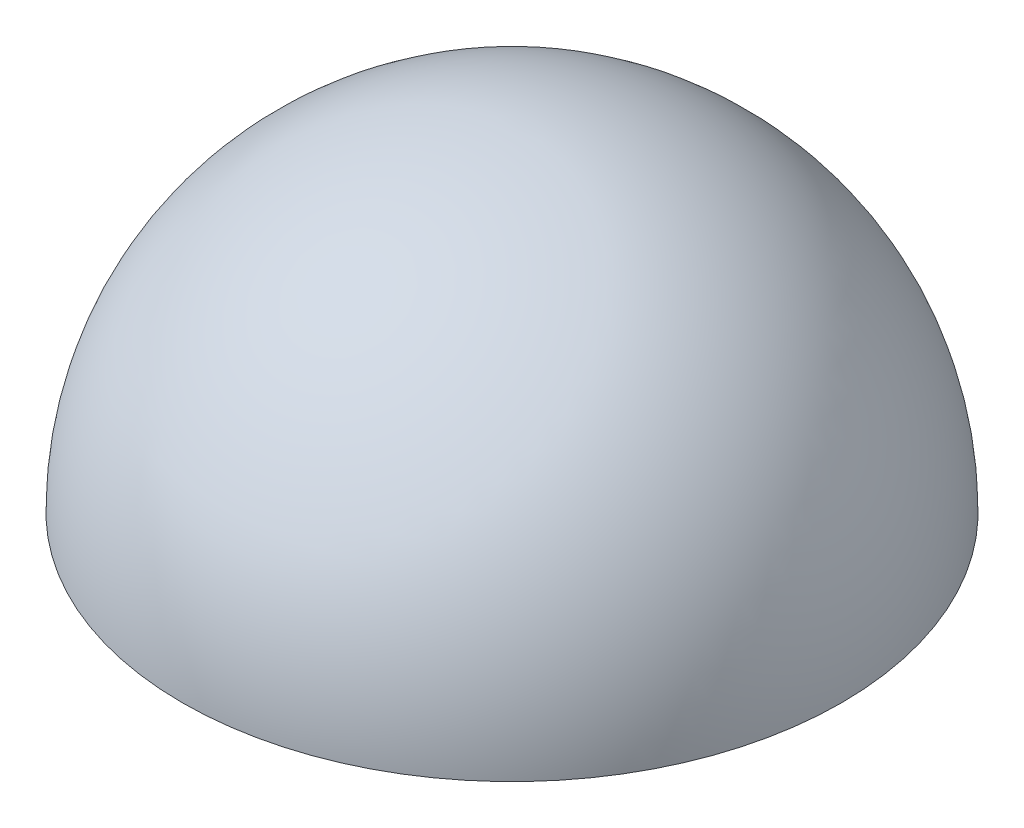
ISO-10303-21;
HEADER;
FILE_DESCRIPTION(('STEP AP214'),'2;1');
FILE_NAME('part.step','',(''),(''),'','','');
FILE_SCHEMA(('AUTOMOTIVE_DESIGN { 1 0 10303 214 1 1 1 1 }'));
ENDSEC;
DATA;
#1=APPLICATION_CONTEXT('core data for automotive mechanical design processes');
#2=APPLICATION_PROTOCOL_DEFINITION('international standard','automotive_design',2000,#1);
#3=PRODUCT_CONTEXT('',#1,'mechanical');
#4=PRODUCT('Part','Part','',(#3));
#5=PRODUCT_RELATED_PRODUCT_CATEGORY('part','',(#4));
#6=PRODUCT_DEFINITION_FORMATION('','',#4);
#7=PRODUCT_DEFINITION_CONTEXT('part definition',#1,'design');
#8=PRODUCT_DEFINITION('design','',#6,#7);
#9=PRODUCT_DEFINITION_SHAPE('','',#8);
#10=(LENGTH_UNIT() NAMED_UNIT(*) SI_UNIT(.MILLI.,.METRE.));
#11=(NAMED_UNIT(*) PLANE_ANGLE_UNIT() SI_UNIT($,.RADIAN.));
#12=(NAMED_UNIT(*) SI_UNIT($,.STERADIAN.) SOLID_ANGLE_UNIT());
#13=UNCERTAINTY_MEASURE_WITH_UNIT(LENGTH_MEASURE(1.E-05),#10,'distance_accuracy_value','');
#14=(GEOMETRIC_REPRESENTATION_CONTEXT(3) GLOBAL_UNCERTAINTY_ASSIGNED_CONTEXT((#13)) GLOBAL_UNIT_ASSIGNED_CONTEXT((#10,
#11,#12)) REPRESENTATION_CONTEXT('',''));
#15=CARTESIAN_POINT('',(0.,0.,0.));
#16=DIRECTION('',(0.,0.,1.));
#17=DIRECTION('',(1.,0.,0.));
#18=AXIS2_PLACEMENT_3D('',#15,#16,#17);
#19=CARTESIAN_POINT('',(0.,5.,0.));
#20=DIRECTION('',(0.,-1.,0.));
#21=DIRECTION('',(0.,0.,-1.));
#22=AXIS2_PLACEMENT_3D('',#19,#20,#21);
#23=CYLINDRICAL_SURFACE('',#22,12.4);
#24=CARTESIAN_POINT('',(0.,5.,0.));
#25=DIRECTION('',(0.,1.,0.));
#26=DIRECTION('',(0.,0.,1.));
#27=AXIS2_PLACEMENT_3D('',#24,#25,#26);
#28=CIRCLE('',#27,12.4);
#29=CARTESIAN_POINT('',(0.,5.,12.4));
#30=VERTEX_POINT('',#29);
#31=EDGE_CURVE('E10',#30,#30,#28,.T.);
#32=ORIENTED_EDGE('',*,*,#31,.F.);
#33=EDGE_LOOP('',(#32));
#34=FACE_BOUND('',#33,.T.);
#35=CARTESIAN_POINT('',(0.,0.,0.));
#36=DIRECTION('',(0.,1.,0.));
#37=DIRECTION('',(0.,0.,1.));
#38=AXIS2_PLACEMENT_3D('',#35,#36,#37);
#39=CIRCLE('',#38,12.4);
#40=CARTESIAN_POINT('',(0.,0.,12.4));
#41=VERTEX_POINT('',#40);
#42=EDGE_CURVE('E46',#41,#41,#39,.T.);
#43=ORIENTED_EDGE('',*,*,#42,.T.);
#44=EDGE_LOOP('',(#43));
#45=FACE_BOUND('',#44,.T.);
#46=ADVANCED_FACE('F43',(#34,#45),#23,.T.);
#47=CARTESIAN_POINT('',(0.,0.,0.));
#48=DIRECTION('',(0.,1.,0.));
#49=DIRECTION('',(0.,0.,1.));
#50=AXIS2_PLACEMENT_3D('',#47,#48,#49);
#51=PLANE('',#50);
#52=ORIENTED_EDGE('',*,*,#42,.F.);
#53=EDGE_LOOP('',(#52));
#54=FACE_BOUND('',#53,.T.);
#55=ADVANCED_FACE('F65',(#54),#51,.F.);
#56=CARTESIAN_POINT('',(0.,5.,0.));
#57=DIRECTION('',(0.,1.,0.));
#58=DIRECTION('',(0.,0.,1.));
#59=AXIS2_PLACEMENT_3D('',#56,#57,#58);
#60=PLANE('',#59);
#61=ORIENTED_EDGE('',*,*,#31,.T.);
#62=EDGE_LOOP('',(#61));
#63=FACE_BOUND('',#62,.T.);
#64=CARTESIAN_POINT('',(0.,5.,0.));
#65=DIRECTION('',(0.,1.,0.));
#66=DIRECTION('',(0.,0.,1.));
#67=AXIS2_PLACEMENT_3D('',#64,#65,#66);
#68=CIRCLE('',#67,50.);
#69=CARTESIAN_POINT('',(0.,5.,50.));
#70=VERTEX_POINT('',#69);
#71=EDGE_CURVE('E55',#70,#70,#68,.T.);
#72=ORIENTED_EDGE('',*,*,#71,.F.);
#73=EDGE_LOOP('',(#72));
#74=FACE_BOUND('',#73,.T.);
#75=ADVANCED_FACE('F63',(#63,#74),#60,.F.);
#76=CARTESIAN_POINT('',(0.,5.,0.));
#77=DIRECTION('',(0.,1.,0.));
#78=DIRECTION('',(1.,0.,0.));
#79=AXIS2_PLACEMENT_3D('',#76,#77,#78);
#80=SPHERICAL_SURFACE('',#79,50.);
#81=ORIENTED_EDGE('',*,*,#71,.T.);
#82=EDGE_LOOP('',(#81));
#83=FACE_BOUND('',#82,.T.);
#84=ADVANCED_FACE('F61',(#83),#80,.T.);
#85=CLOSED_SHELL('',(#46,#55,#75,#84));
#86=MANIFOLD_SOLID_BREP('B2',#85);
#87=ADVANCED_BREP_SHAPE_REPRESENTATION('',(#18,#86),#14);
#88=SHAPE_DEFINITION_REPRESENTATION(#9,#87);
ENDSEC;
END-ISO-10303-21;
